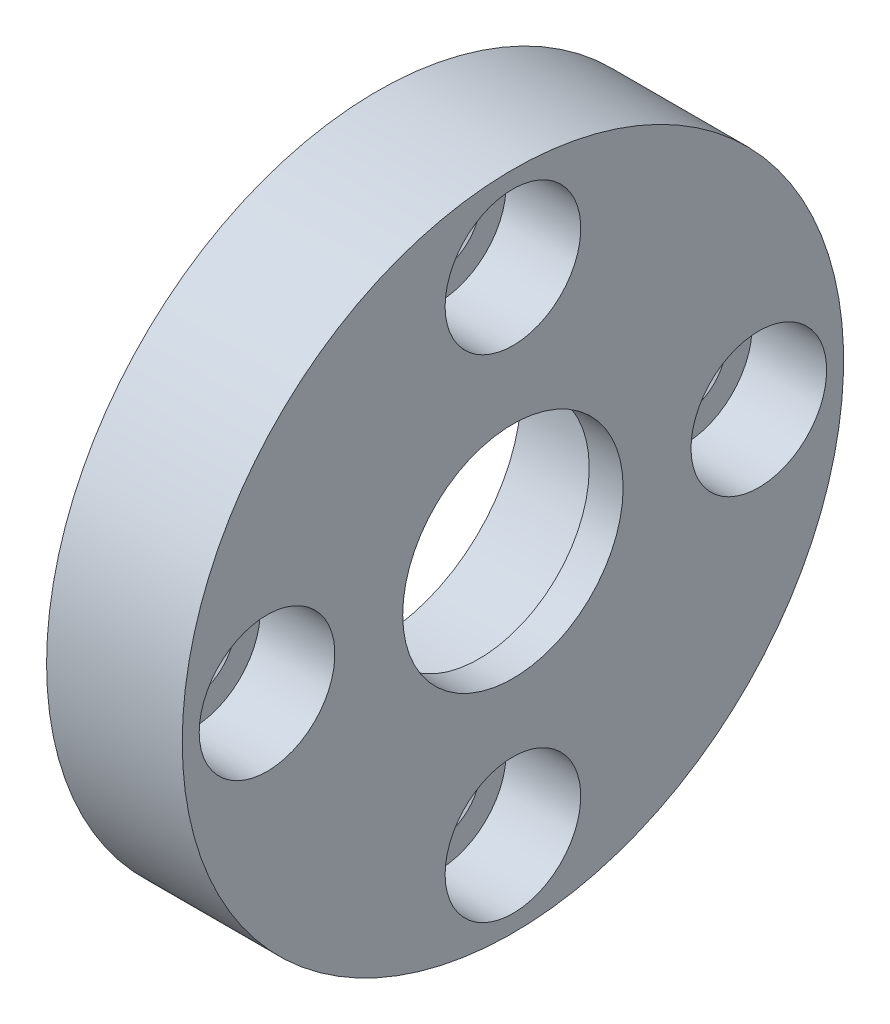
ISO-10303-21;
HEADER;
FILE_DESCRIPTION(('STEP AP214'),'2;1');
FILE_NAME('part.step','',(''),(''),'','','');
FILE_SCHEMA(('AUTOMOTIVE_DESIGN { 1 0 10303 214 1 1 1 1 }'));
ENDSEC;
DATA;
#1=APPLICATION_CONTEXT('core data for automotive mechanical design processes');
#2=APPLICATION_PROTOCOL_DEFINITION('international standard','automotive_design',2000,#1);
#3=PRODUCT_CONTEXT('',#1,'mechanical');
#4=PRODUCT('Part','Part','',(#3));
#5=PRODUCT_RELATED_PRODUCT_CATEGORY('part','',(#4));
#6=PRODUCT_DEFINITION_FORMATION('','',#4);
#7=PRODUCT_DEFINITION_CONTEXT('part definition',#1,'design');
#8=PRODUCT_DEFINITION('design','',#6,#7);
#9=PRODUCT_DEFINITION_SHAPE('','',#8);
#10=(LENGTH_UNIT() NAMED_UNIT(*) SI_UNIT(.MILLI.,.METRE.));
#11=(NAMED_UNIT(*) PLANE_ANGLE_UNIT() SI_UNIT($,.RADIAN.));
#12=(NAMED_UNIT(*) SI_UNIT($,.STERADIAN.) SOLID_ANGLE_UNIT());
#13=UNCERTAINTY_MEASURE_WITH_UNIT(LENGTH_MEASURE(1.E-05),#10,'distance_accuracy_value','');
#14=(GEOMETRIC_REPRESENTATION_CONTEXT(3) GLOBAL_UNCERTAINTY_ASSIGNED_CONTEXT((#13)) GLOBAL_UNIT_ASSIGNED_CONTEXT((#10,
#11,#12)) REPRESENTATION_CONTEXT('',''));
#15=CARTESIAN_POINT('',(0.,0.,0.));
#16=DIRECTION('',(0.,0.,1.));
#17=DIRECTION('',(1.,0.,0.));
#18=AXIS2_PLACEMENT_3D('',#15,#16,#17);
#19=CARTESIAN_POINT('',(-4.,0.,0.));
#20=DIRECTION('',(1.,0.,0.));
#21=DIRECTION('',(0.,0.,-1.));
#22=AXIS2_PLACEMENT_3D('',#19,#20,#21);
#23=PLANE('',#22);
#24=CARTESIAN_POINT('',(-4.,0.,-14.5));
#25=DIRECTION('',(-1.,0.,0.));
#26=DIRECTION('',(0.,0.,1.));
#27=AXIS2_PLACEMENT_3D('',#24,#25,#26);
#28=CIRCLE('',#27,2.5);
#29=CARTESIAN_POINT('',(-4.,0.,-12.));
#30=VERTEX_POINT('',#29);
#31=EDGE_CURVE('E110',#30,#30,#28,.T.);
#32=ORIENTED_EDGE('',*,*,#31,.F.);
#33=EDGE_LOOP('',(#32));
#34=FACE_BOUND('',#33,.T.);
#35=CARTESIAN_POINT('',(-4.,-14.5,0.));
#36=DIRECTION('',(-1.,0.,0.));
#37=DIRECTION('',(0.,0.,1.));
#38=AXIS2_PLACEMENT_3D('',#35,#36,#37);
#39=CIRCLE('',#38,2.5);
#40=CARTESIAN_POINT('',(-4.,-14.5,2.5));
#41=VERTEX_POINT('',#40);
#42=EDGE_CURVE('E92',#41,#41,#39,.T.);
#43=ORIENTED_EDGE('',*,*,#42,.F.);
#44=EDGE_LOOP('',(#43));
#45=FACE_BOUND('',#44,.T.);
#46=CARTESIAN_POINT('',(-4.,0.,14.5));
#47=DIRECTION('',(-1.,0.,0.));
#48=DIRECTION('',(0.,0.,1.));
#49=AXIS2_PLACEMENT_3D('',#46,#47,#48);
#50=CIRCLE('',#49,2.5);
#51=CARTESIAN_POINT('',(-4.,0.,17.));
#52=VERTEX_POINT('',#51);
#53=EDGE_CURVE('E74',#52,#52,#50,.T.);
#54=ORIENTED_EDGE('',*,*,#53,.F.);
#55=EDGE_LOOP('',(#54));
#56=FACE_BOUND('',#55,.T.);
#57=CARTESIAN_POINT('',(-4.,14.5,0.));
#58=DIRECTION('',(-1.,0.,0.));
#59=DIRECTION('',(0.,0.,1.));
#60=AXIS2_PLACEMENT_3D('',#57,#58,#59);
#61=CIRCLE('',#60,2.5);
#62=CARTESIAN_POINT('',(-4.,14.5,2.5));
#63=VERTEX_POINT('',#62);
#64=EDGE_CURVE('E56',#63,#63,#61,.T.);
#65=ORIENTED_EDGE('',*,*,#64,.F.);
#66=EDGE_LOOP('',(#65));
#67=FACE_BOUND('',#66,.T.);
#68=CARTESIAN_POINT('',(-4.,0.,0.));
#69=DIRECTION('',(-1.,0.,0.));
#70=DIRECTION('',(0.,0.,1.));
#71=AXIS2_PLACEMENT_3D('',#68,#69,#70);
#72=CIRCLE('',#71,8.5);
#73=CARTESIAN_POINT('',(-4.,0.,8.5));
#74=VERTEX_POINT('',#73);
#75=EDGE_CURVE('E41',#74,#74,#72,.T.);
#76=ORIENTED_EDGE('',*,*,#75,.F.);
#77=EDGE_LOOP('',(#76));
#78=FACE_BOUND('',#77,.T.);
#79=CARTESIAN_POINT('',(-4.,0.,0.));
#80=DIRECTION('',(-1.,0.,0.));
#81=DIRECTION('',(0.,0.,1.));
#82=AXIS2_PLACEMENT_3D('',#79,#80,#81);
#83=CIRCLE('',#82,19.5);
#84=CARTESIAN_POINT('',(-4.,0.,19.5));
#85=VERTEX_POINT('',#84);
#86=EDGE_CURVE('E10',#85,#85,#83,.T.);
#87=ORIENTED_EDGE('',*,*,#86,.T.);
#88=EDGE_LOOP('',(#87));
#89=FACE_BOUND('',#88,.T.);
#90=ADVANCED_FACE('F31',(#34,#45,#56,#67,#78,#89),#23,.F.);
#91=CARTESIAN_POINT('',(4.,0.,0.));
#92=DIRECTION('',(-1.,0.,0.));
#93=DIRECTION('',(0.,0.,1.));
#94=AXIS2_PLACEMENT_3D('',#91,#92,#93);
#95=CYLINDRICAL_SURFACE('',#94,19.5);
#96=ORIENTED_EDGE('',*,*,#86,.F.);
#97=EDGE_LOOP('',(#96));
#98=FACE_BOUND('',#97,.T.);
#99=CARTESIAN_POINT('',(4.,0.,0.));
#100=DIRECTION('',(-1.,0.,0.));
#101=DIRECTION('',(0.,0.,1.));
#102=AXIS2_PLACEMENT_3D('',#99,#100,#101);
#103=CIRCLE('',#102,19.5);
#104=CARTESIAN_POINT('',(4.,0.,19.5));
#105=VERTEX_POINT('',#104);
#106=EDGE_CURVE('E37',#105,#105,#103,.T.);
#107=ORIENTED_EDGE('',*,*,#106,.T.);
#108=EDGE_LOOP('',(#107));
#109=FACE_BOUND('',#108,.T.);
#110=ADVANCED_FACE('F144',(#98,#109),#95,.T.);
#111=CARTESIAN_POINT('',(4.,19.5,0.));
#112=DIRECTION('',(-1.,0.,0.));
#113=DIRECTION('',(0.,0.,1.));
#114=AXIS2_PLACEMENT_3D('',#111,#112,#113);
#115=PLANE('',#114);
#116=CARTESIAN_POINT('',(4.,0.,-14.5));
#117=DIRECTION('',(-1.,0.,0.));
#118=DIRECTION('',(0.,0.,1.));
#119=AXIS2_PLACEMENT_3D('',#116,#117,#118);
#120=CIRCLE('',#119,4.);
#121=CARTESIAN_POINT('',(4.,0.,-10.5));
#122=VERTEX_POINT('',#121);
#123=EDGE_CURVE('E125',#122,#122,#120,.T.);
#124=ORIENTED_EDGE('',*,*,#123,.T.);
#125=EDGE_LOOP('',(#124));
#126=FACE_BOUND('',#125,.T.);
#127=CARTESIAN_POINT('',(4.,-14.5,0.));
#128=DIRECTION('',(-1.,0.,0.));
#129=DIRECTION('',(0.,0.,1.));
#130=AXIS2_PLACEMENT_3D('',#127,#128,#129);
#131=CIRCLE('',#130,4.);
#132=CARTESIAN_POINT('',(4.,-14.5,4.));
#133=VERTEX_POINT('',#132);
#134=EDGE_CURVE('E107',#133,#133,#131,.T.);
#135=ORIENTED_EDGE('',*,*,#134,.T.);
#136=EDGE_LOOP('',(#135));
#137=FACE_BOUND('',#136,.T.);
#138=CARTESIAN_POINT('',(4.,0.,14.5));
#139=DIRECTION('',(-1.,0.,0.));
#140=DIRECTION('',(0.,0.,1.));
#141=AXIS2_PLACEMENT_3D('',#138,#139,#140);
#142=CIRCLE('',#141,4.);
#143=CARTESIAN_POINT('',(4.,0.,18.5));
#144=VERTEX_POINT('',#143);
#145=EDGE_CURVE('E89',#144,#144,#142,.T.);
#146=ORIENTED_EDGE('',*,*,#145,.T.);
#147=EDGE_LOOP('',(#146));
#148=FACE_BOUND('',#147,.T.);
#149=CARTESIAN_POINT('',(4.,14.5,0.));
#150=DIRECTION('',(-1.,0.,0.));
#151=DIRECTION('',(0.,0.,1.));
#152=AXIS2_PLACEMENT_3D('',#149,#150,#151);
#153=CIRCLE('',#152,4.);
#154=CARTESIAN_POINT('',(4.,14.5,4.));
#155=VERTEX_POINT('',#154);
#156=EDGE_CURVE('E71',#155,#155,#153,.T.);
#157=ORIENTED_EDGE('',*,*,#156,.T.);
#158=EDGE_LOOP('',(#157));
#159=FACE_BOUND('',#158,.T.);
#160=CARTESIAN_POINT('',(4.,0.,0.));
#161=DIRECTION('',(-1.,0.,0.));
#162=DIRECTION('',(0.,0.,1.));
#163=AXIS2_PLACEMENT_3D('',#160,#161,#162);
#164=CIRCLE('',#163,6.5);
#165=CARTESIAN_POINT('',(4.,0.,6.5));
#166=VERTEX_POINT('',#165);
#167=EDGE_CURVE('E53',#166,#166,#164,.T.);
#168=ORIENTED_EDGE('',*,*,#167,.T.);
#169=EDGE_LOOP('',(#168));
#170=FACE_BOUND('',#169,.T.);
#171=ORIENTED_EDGE('',*,*,#106,.F.);
#172=EDGE_LOOP('',(#171));
#173=FACE_BOUND('',#172,.T.);
#174=ADVANCED_FACE('F129',(#126,#137,#148,#159,#170,#173),#115,.F.);
#175=CARTESIAN_POINT('',(4.,0.,0.));
#176=DIRECTION('',(-1.,0.,0.));
#177=DIRECTION('',(0.,0.,1.));
#178=AXIS2_PLACEMENT_3D('',#175,#176,#177);
#179=CYLINDRICAL_SURFACE('',#178,8.5);
#180=ORIENTED_EDGE('',*,*,#75,.T.);
#181=EDGE_LOOP('',(#180));
#182=FACE_BOUND('',#181,.T.);
#183=CARTESIAN_POINT('',(2.,0.,0.));
#184=DIRECTION('',(-1.,0.,0.));
#185=DIRECTION('',(0.,0.,1.));
#186=AXIS2_PLACEMENT_3D('',#183,#184,#185);
#187=CIRCLE('',#186,8.5);
#188=CARTESIAN_POINT('',(2.,0.,8.5));
#189=VERTEX_POINT('',#188);
#190=EDGE_CURVE('E45',#189,#189,#187,.T.);
#191=ORIENTED_EDGE('',*,*,#190,.F.);
#192=EDGE_LOOP('',(#191));
#193=FACE_BOUND('',#192,.T.);
#194=ADVANCED_FACE('F160',(#182,#193),#179,.F.);
#195=CARTESIAN_POINT('',(2.,8.5,0.));
#196=DIRECTION('',(-1.,0.,0.));
#197=DIRECTION('',(0.,0.,1.));
#198=AXIS2_PLACEMENT_3D('',#195,#196,#197);
#199=PLANE('',#198);
#200=ORIENTED_EDGE('',*,*,#190,.T.);
#201=EDGE_LOOP('',(#200));
#202=FACE_BOUND('',#201,.T.);
#203=CARTESIAN_POINT('',(2.,0.,0.));
#204=DIRECTION('',(-1.,0.,0.));
#205=DIRECTION('',(0.,0.,1.));
#206=AXIS2_PLACEMENT_3D('',#203,#204,#205);
#207=CIRCLE('',#206,6.5);
#208=CARTESIAN_POINT('',(2.,0.,6.5));
#209=VERTEX_POINT('',#208);
#210=EDGE_CURVE('E50',#209,#209,#207,.T.);
#211=ORIENTED_EDGE('',*,*,#210,.F.);
#212=EDGE_LOOP('',(#211));
#213=FACE_BOUND('',#212,.T.);
#214=ADVANCED_FACE('F163',(#202,#213),#199,.T.);
#215=CARTESIAN_POINT('',(4.,0.,0.));
#216=DIRECTION('',(-1.,0.,0.));
#217=DIRECTION('',(0.,0.,1.));
#218=AXIS2_PLACEMENT_3D('',#215,#216,#217);
#219=CYLINDRICAL_SURFACE('',#218,6.5);
#220=ORIENTED_EDGE('',*,*,#210,.T.);
#221=EDGE_LOOP('',(#220));
#222=FACE_BOUND('',#221,.T.);
#223=ORIENTED_EDGE('',*,*,#167,.F.);
#224=EDGE_LOOP('',(#223));
#225=FACE_BOUND('',#224,.T.);
#226=ADVANCED_FACE('F169',(#222,#225),#219,.F.);
#227=CARTESIAN_POINT('',(-3.567,14.5,0.));
#228=DIRECTION('',(-1.,0.,0.));
#229=DIRECTION('',(0.,0.,1.));
#230=AXIS2_PLACEMENT_3D('',#227,#228,#229);
#231=CONICAL_SURFACE('',#230,2.067,0.785398163397451);
#232=ORIENTED_EDGE('',*,*,#64,.T.);
#233=EDGE_LOOP('',(#232));
#234=FACE_BOUND('',#233,.T.);
#235=CARTESIAN_POINT('',(-3.567,14.5,0.));
#236=DIRECTION('',(-1.,0.,0.));
#237=DIRECTION('',(0.,0.,1.));
#238=AXIS2_PLACEMENT_3D('',#235,#236,#237);
#239=CIRCLE('',#238,2.067);
#240=CARTESIAN_POINT('',(-3.567,14.5,2.067));
#241=VERTEX_POINT('',#240);
#242=EDGE_CURVE('E59',#241,#241,#239,.T.);
#243=ORIENTED_EDGE('',*,*,#242,.F.);
#244=EDGE_LOOP('',(#243));
#245=FACE_BOUND('',#244,.T.);
#246=ADVANCED_FACE('F175',(#234,#245),#231,.F.);
#247=CARTESIAN_POINT('',(4.,14.5,0.));
#248=DIRECTION('',(-1.,0.,0.));
#249=DIRECTION('',(0.,0.,1.));
#250=AXIS2_PLACEMENT_3D('',#247,#248,#249);
#251=CYLINDRICAL_SURFACE('',#250,2.067);
#252=ORIENTED_EDGE('',*,*,#242,.T.);
#253=EDGE_LOOP('',(#252));
#254=FACE_BOUND('',#253,.T.);
#255=CARTESIAN_POINT('',(-0.83299999999999,14.5,0.));
#256=DIRECTION('',(-1.,0.,0.));
#257=DIRECTION('',(0.,0.,1.));
#258=AXIS2_PLACEMENT_3D('',#255,#256,#257);
#259=CIRCLE('',#258,2.067);
#260=CARTESIAN_POINT('',(-0.83299999999999,14.5,2.067));
#261=VERTEX_POINT('',#260);
#262=EDGE_CURVE('E62',#261,#261,#259,.T.);
#263=ORIENTED_EDGE('',*,*,#262,.F.);
#264=EDGE_LOOP('',(#263));
#265=FACE_BOUND('',#264,.T.);
#266=ADVANCED_FACE('F187',(#254,#265),#251,.F.);
#267=CARTESIAN_POINT('',(-0.4,14.5,0.));
#268=DIRECTION('',(1.,0.,0.));
#269=DIRECTION('',(0.,0.,-1.));
#270=AXIS2_PLACEMENT_3D('',#267,#268,#269);
#271=CONICAL_SURFACE('',#270,2.5,0.785398163397463);
#272=ORIENTED_EDGE('',*,*,#262,.T.);
#273=EDGE_LOOP('',(#272));
#274=FACE_BOUND('',#273,.T.);
#275=CARTESIAN_POINT('',(-0.4,14.5,0.));
#276=DIRECTION('',(-1.,0.,0.));
#277=DIRECTION('',(0.,0.,1.));
#278=AXIS2_PLACEMENT_3D('',#275,#276,#277);
#279=CIRCLE('',#278,2.5);
#280=CARTESIAN_POINT('',(-0.4,14.5,2.5));
#281=VERTEX_POINT('',#280);
#282=EDGE_CURVE('E65',#281,#281,#279,.T.);
#283=ORIENTED_EDGE('',*,*,#282,.F.);
#284=EDGE_LOOP('',(#283));
#285=FACE_BOUND('',#284,.T.);
#286=ADVANCED_FACE('F191',(#274,#285),#271,.F.);
#287=CARTESIAN_POINT('',(-0.4,17.,0.));
#288=DIRECTION('',(1.,0.,0.));
#289=DIRECTION('',(0.,0.,-1.));
#290=AXIS2_PLACEMENT_3D('',#287,#288,#289);
#291=PLANE('',#290);
#292=ORIENTED_EDGE('',*,*,#282,.T.);
#293=EDGE_LOOP('',(#292));
#294=FACE_BOUND('',#293,.T.);
#295=CARTESIAN_POINT('',(-0.4,14.5,0.));
#296=DIRECTION('',(-1.,0.,0.));
#297=DIRECTION('',(0.,0.,1.));
#298=AXIS2_PLACEMENT_3D('',#295,#296,#297);
#299=CIRCLE('',#298,4.);
#300=CARTESIAN_POINT('',(-0.4,14.5,4.));
#301=VERTEX_POINT('',#300);
#302=EDGE_CURVE('E68',#301,#301,#299,.T.);
#303=ORIENTED_EDGE('',*,*,#302,.F.);
#304=EDGE_LOOP('',(#303));
#305=FACE_BOUND('',#304,.T.);
#306=ADVANCED_FACE('F195',(#294,#305),#291,.T.);
#307=CARTESIAN_POINT('',(4.,14.5,0.));
#308=DIRECTION('',(-1.,0.,0.));
#309=DIRECTION('',(0.,0.,1.));
#310=AXIS2_PLACEMENT_3D('',#307,#308,#309);
#311=CYLINDRICAL_SURFACE('',#310,4.);
#312=ORIENTED_EDGE('',*,*,#302,.T.);
#313=EDGE_LOOP('',(#312));
#314=FACE_BOUND('',#313,.T.);
#315=ORIENTED_EDGE('',*,*,#156,.F.);
#316=EDGE_LOOP('',(#315));
#317=FACE_BOUND('',#316,.T.);
#318=ADVANCED_FACE('F199',(#314,#317),#311,.F.);
#319=CARTESIAN_POINT('',(-3.567,0.,14.5));
#320=DIRECTION('',(-1.,0.,0.));
#321=DIRECTION('',(0.,0.,1.));
#322=AXIS2_PLACEMENT_3D('',#319,#320,#321);
#323=CONICAL_SURFACE('',#322,2.067,0.785398163397451);
#324=ORIENTED_EDGE('',*,*,#53,.T.);
#325=EDGE_LOOP('',(#324));
#326=FACE_BOUND('',#325,.T.);
#327=CARTESIAN_POINT('',(-3.567,0.,14.5));
#328=DIRECTION('',(-1.,0.,0.));
#329=DIRECTION('',(0.,0.,1.));
#330=AXIS2_PLACEMENT_3D('',#327,#328,#329);
#331=CIRCLE('',#330,2.067);
#332=CARTESIAN_POINT('',(-3.567,0.,16.567));
#333=VERTEX_POINT('',#332);
#334=EDGE_CURVE('E77',#333,#333,#331,.T.);
#335=ORIENTED_EDGE('',*,*,#334,.F.);
#336=EDGE_LOOP('',(#335));
#337=FACE_BOUND('',#336,.T.);
#338=ADVANCED_FACE('F203',(#326,#337),#323,.F.);
#339=CARTESIAN_POINT('',(4.,0.,14.5));
#340=DIRECTION('',(-1.,0.,0.));
#341=DIRECTION('',(0.,0.,1.));
#342=AXIS2_PLACEMENT_3D('',#339,#340,#341);
#343=CYLINDRICAL_SURFACE('',#342,2.067);
#344=ORIENTED_EDGE('',*,*,#334,.T.);
#345=EDGE_LOOP('',(#344));
#346=FACE_BOUND('',#345,.T.);
#347=CARTESIAN_POINT('',(-0.83299999999999,0.,14.5));
#348=DIRECTION('',(-1.,0.,0.));
#349=DIRECTION('',(0.,0.,1.));
#350=AXIS2_PLACEMENT_3D('',#347,#348,#349);
#351=CIRCLE('',#350,2.067);
#352=CARTESIAN_POINT('',(-0.83299999999999,0.,16.567));
#353=VERTEX_POINT('',#352);
#354=EDGE_CURVE('E80',#353,#353,#351,.T.);
#355=ORIENTED_EDGE('',*,*,#354,.F.);
#356=EDGE_LOOP('',(#355));
#357=FACE_BOUND('',#356,.T.);
#358=ADVANCED_FACE('F207',(#346,#357),#343,.F.);
#359=CARTESIAN_POINT('',(-0.4,0.,14.5));
#360=DIRECTION('',(1.,0.,0.));
#361=DIRECTION('',(0.,0.,-1.));
#362=AXIS2_PLACEMENT_3D('',#359,#360,#361);
#363=CONICAL_SURFACE('',#362,2.5,0.785398163397463);
#364=ORIENTED_EDGE('',*,*,#354,.T.);
#365=EDGE_LOOP('',(#364));
#366=FACE_BOUND('',#365,.T.);
#367=CARTESIAN_POINT('',(-0.4,0.,14.5));
#368=DIRECTION('',(-1.,0.,0.));
#369=DIRECTION('',(0.,0.,1.));
#370=AXIS2_PLACEMENT_3D('',#367,#368,#369);
#371=CIRCLE('',#370,2.5);
#372=CARTESIAN_POINT('',(-0.4,0.,17.));
#373=VERTEX_POINT('',#372);
#374=EDGE_CURVE('E83',#373,#373,#371,.T.);
#375=ORIENTED_EDGE('',*,*,#374,.F.);
#376=EDGE_LOOP('',(#375));
#377=FACE_BOUND('',#376,.T.);
#378=ADVANCED_FACE('F211',(#366,#377),#363,.F.);
#379=CARTESIAN_POINT('',(-0.4,2.5,14.5));
#380=DIRECTION('',(1.,0.,0.));
#381=DIRECTION('',(0.,0.,-1.));
#382=AXIS2_PLACEMENT_3D('',#379,#380,#381);
#383=PLANE('',#382);
#384=ORIENTED_EDGE('',*,*,#374,.T.);
#385=EDGE_LOOP('',(#384));
#386=FACE_BOUND('',#385,.T.);
#387=CARTESIAN_POINT('',(-0.4,0.,14.5));
#388=DIRECTION('',(-1.,0.,0.));
#389=DIRECTION('',(0.,0.,1.));
#390=AXIS2_PLACEMENT_3D('',#387,#388,#389);
#391=CIRCLE('',#390,4.);
#392=CARTESIAN_POINT('',(-0.4,0.,18.5));
#393=VERTEX_POINT('',#392);
#394=EDGE_CURVE('E86',#393,#393,#391,.T.);
#395=ORIENTED_EDGE('',*,*,#394,.F.);
#396=EDGE_LOOP('',(#395));
#397=FACE_BOUND('',#396,.T.);
#398=ADVANCED_FACE('F215',(#386,#397),#383,.T.);
#399=CARTESIAN_POINT('',(4.,0.,14.5));
#400=DIRECTION('',(-1.,0.,0.));
#401=DIRECTION('',(0.,0.,1.));
#402=AXIS2_PLACEMENT_3D('',#399,#400,#401);
#403=CYLINDRICAL_SURFACE('',#402,4.);
#404=ORIENTED_EDGE('',*,*,#394,.T.);
#405=EDGE_LOOP('',(#404));
#406=FACE_BOUND('',#405,.T.);
#407=ORIENTED_EDGE('',*,*,#145,.F.);
#408=EDGE_LOOP('',(#407));
#409=FACE_BOUND('',#408,.T.);
#410=ADVANCED_FACE('F219',(#406,#409),#403,.F.);
#411=CARTESIAN_POINT('',(-3.567,-14.5,0.));
#412=DIRECTION('',(-1.,0.,0.));
#413=DIRECTION('',(0.,0.,1.));
#414=AXIS2_PLACEMENT_3D('',#411,#412,#413);
#415=CONICAL_SURFACE('',#414,2.067,0.785398163397451);
#416=ORIENTED_EDGE('',*,*,#42,.T.);
#417=EDGE_LOOP('',(#416));
#418=FACE_BOUND('',#417,.T.);
#419=CARTESIAN_POINT('',(-3.567,-14.5,0.));
#420=DIRECTION('',(-1.,0.,0.));
#421=DIRECTION('',(0.,0.,1.));
#422=AXIS2_PLACEMENT_3D('',#419,#420,#421);
#423=CIRCLE('',#422,2.067);
#424=CARTESIAN_POINT('',(-3.567,-14.5,2.067));
#425=VERTEX_POINT('',#424);
#426=EDGE_CURVE('E95',#425,#425,#423,.T.);
#427=ORIENTED_EDGE('',*,*,#426,.F.);
#428=EDGE_LOOP('',(#427));
#429=FACE_BOUND('',#428,.T.);
#430=ADVANCED_FACE('F223',(#418,#429),#415,.F.);
#431=CARTESIAN_POINT('',(4.,-14.5,0.));
#432=DIRECTION('',(-1.,0.,0.));
#433=DIRECTION('',(0.,0.,1.));
#434=AXIS2_PLACEMENT_3D('',#431,#432,#433);
#435=CYLINDRICAL_SURFACE('',#434,2.067);
#436=ORIENTED_EDGE('',*,*,#426,.T.);
#437=EDGE_LOOP('',(#436));
#438=FACE_BOUND('',#437,.T.);
#439=CARTESIAN_POINT('',(-0.83299999999999,-14.5,0.));
#440=DIRECTION('',(-1.,0.,0.));
#441=DIRECTION('',(0.,0.,1.));
#442=AXIS2_PLACEMENT_3D('',#439,#440,#441);
#443=CIRCLE('',#442,2.067);
#444=CARTESIAN_POINT('',(-0.83299999999999,-14.5,2.067));
#445=VERTEX_POINT('',#444);
#446=EDGE_CURVE('E98',#445,#445,#443,.T.);
#447=ORIENTED_EDGE('',*,*,#446,.F.);
#448=EDGE_LOOP('',(#447));
#449=FACE_BOUND('',#448,.T.);
#450=ADVANCED_FACE('F227',(#438,#449),#435,.F.);
#451=CARTESIAN_POINT('',(-0.4,-14.5,0.));
#452=DIRECTION('',(1.,0.,0.));
#453=DIRECTION('',(0.,0.,-1.));
#454=AXIS2_PLACEMENT_3D('',#451,#452,#453);
#455=CONICAL_SURFACE('',#454,2.5,0.785398163397463);
#456=ORIENTED_EDGE('',*,*,#446,.T.);
#457=EDGE_LOOP('',(#456));
#458=FACE_BOUND('',#457,.T.);
#459=CARTESIAN_POINT('',(-0.4,-14.5,0.));
#460=DIRECTION('',(-1.,0.,0.));
#461=DIRECTION('',(0.,0.,1.));
#462=AXIS2_PLACEMENT_3D('',#459,#460,#461);
#463=CIRCLE('',#462,2.5);
#464=CARTESIAN_POINT('',(-0.4,-14.5,2.5));
#465=VERTEX_POINT('',#464);
#466=EDGE_CURVE('E101',#465,#465,#463,.T.);
#467=ORIENTED_EDGE('',*,*,#466,.F.);
#468=EDGE_LOOP('',(#467));
#469=FACE_BOUND('',#468,.T.);
#470=ADVANCED_FACE('F231',(#458,#469),#455,.F.);
#471=CARTESIAN_POINT('',(-0.4,-12.,0.));
#472=DIRECTION('',(1.,0.,0.));
#473=DIRECTION('',(0.,0.,-1.));
#474=AXIS2_PLACEMENT_3D('',#471,#472,#473);
#475=PLANE('',#474);
#476=ORIENTED_EDGE('',*,*,#466,.T.);
#477=EDGE_LOOP('',(#476));
#478=FACE_BOUND('',#477,.T.);
#479=CARTESIAN_POINT('',(-0.4,-14.5,0.));
#480=DIRECTION('',(-1.,0.,0.));
#481=DIRECTION('',(0.,0.,1.));
#482=AXIS2_PLACEMENT_3D('',#479,#480,#481);
#483=CIRCLE('',#482,4.);
#484=CARTESIAN_POINT('',(-0.4,-14.5,4.));
#485=VERTEX_POINT('',#484);
#486=EDGE_CURVE('E104',#485,#485,#483,.T.);
#487=ORIENTED_EDGE('',*,*,#486,.F.);
#488=EDGE_LOOP('',(#487));
#489=FACE_BOUND('',#488,.T.);
#490=ADVANCED_FACE('F235',(#478,#489),#475,.T.);
#491=CARTESIAN_POINT('',(4.,-14.5,0.));
#492=DIRECTION('',(-1.,0.,0.));
#493=DIRECTION('',(0.,0.,1.));
#494=AXIS2_PLACEMENT_3D('',#491,#492,#493);
#495=CYLINDRICAL_SURFACE('',#494,4.);
#496=ORIENTED_EDGE('',*,*,#486,.T.);
#497=EDGE_LOOP('',(#496));
#498=FACE_BOUND('',#497,.T.);
#499=ORIENTED_EDGE('',*,*,#134,.F.);
#500=EDGE_LOOP('',(#499));
#501=FACE_BOUND('',#500,.T.);
#502=ADVANCED_FACE('F239',(#498,#501),#495,.F.);
#503=CARTESIAN_POINT('',(-3.567,0.,-14.5));
#504=DIRECTION('',(-1.,0.,0.));
#505=DIRECTION('',(0.,0.,1.));
#506=AXIS2_PLACEMENT_3D('',#503,#504,#505);
#507=CONICAL_SURFACE('',#506,2.067,0.785398163397451);
#508=ORIENTED_EDGE('',*,*,#31,.T.);
#509=EDGE_LOOP('',(#508));
#510=FACE_BOUND('',#509,.T.);
#511=CARTESIAN_POINT('',(-3.567,0.,-14.5));
#512=DIRECTION('',(-1.,0.,0.));
#513=DIRECTION('',(0.,0.,1.));
#514=AXIS2_PLACEMENT_3D('',#511,#512,#513);
#515=CIRCLE('',#514,2.067);
#516=CARTESIAN_POINT('',(-3.567,0.,-12.433));
#517=VERTEX_POINT('',#516);
#518=EDGE_CURVE('E113',#517,#517,#515,.T.);
#519=ORIENTED_EDGE('',*,*,#518,.F.);
#520=EDGE_LOOP('',(#519));
#521=FACE_BOUND('',#520,.T.);
#522=ADVANCED_FACE('F243',(#510,#521),#507,.F.);
#523=CARTESIAN_POINT('',(4.,0.,-14.5));
#524=DIRECTION('',(-1.,0.,0.));
#525=DIRECTION('',(0.,0.,1.));
#526=AXIS2_PLACEMENT_3D('',#523,#524,#525);
#527=CYLINDRICAL_SURFACE('',#526,2.067);
#528=ORIENTED_EDGE('',*,*,#518,.T.);
#529=EDGE_LOOP('',(#528));
#530=FACE_BOUND('',#529,.T.);
#531=CARTESIAN_POINT('',(-0.83299999999999,0.,-14.5));
#532=DIRECTION('',(-1.,0.,0.));
#533=DIRECTION('',(0.,0.,1.));
#534=AXIS2_PLACEMENT_3D('',#531,#532,#533);
#535=CIRCLE('',#534,2.067);
#536=CARTESIAN_POINT('',(-0.83299999999999,0.,-12.433));
#537=VERTEX_POINT('',#536);
#538=EDGE_CURVE('E116',#537,#537,#535,.T.);
#539=ORIENTED_EDGE('',*,*,#538,.F.);
#540=EDGE_LOOP('',(#539));
#541=FACE_BOUND('',#540,.T.);
#542=ADVANCED_FACE('F247',(#530,#541),#527,.F.);
#543=CARTESIAN_POINT('',(-0.4,0.,-14.5));
#544=DIRECTION('',(1.,0.,0.));
#545=DIRECTION('',(0.,0.,-1.));
#546=AXIS2_PLACEMENT_3D('',#543,#544,#545);
#547=CONICAL_SURFACE('',#546,2.5,0.785398163397463);
#548=ORIENTED_EDGE('',*,*,#538,.T.);
#549=EDGE_LOOP('',(#548));
#550=FACE_BOUND('',#549,.T.);
#551=CARTESIAN_POINT('',(-0.4,0.,-14.5));
#552=DIRECTION('',(-1.,0.,0.));
#553=DIRECTION('',(0.,0.,1.));
#554=AXIS2_PLACEMENT_3D('',#551,#552,#553);
#555=CIRCLE('',#554,2.5);
#556=CARTESIAN_POINT('',(-0.4,0.,-12.));
#557=VERTEX_POINT('',#556);
#558=EDGE_CURVE('E119',#557,#557,#555,.T.);
#559=ORIENTED_EDGE('',*,*,#558,.F.);
#560=EDGE_LOOP('',(#559));
#561=FACE_BOUND('',#560,.T.);
#562=ADVANCED_FACE('F140',(#550,#561),#547,.F.);
#563=CARTESIAN_POINT('',(-0.4,2.5,-14.5));
#564=DIRECTION('',(1.,0.,0.));
#565=DIRECTION('',(0.,0.,-1.));
#566=AXIS2_PLACEMENT_3D('',#563,#564,#565);
#567=PLANE('',#566);
#568=ORIENTED_EDGE('',*,*,#558,.T.);
#569=EDGE_LOOP('',(#568));
#570=FACE_BOUND('',#569,.T.);
#571=CARTESIAN_POINT('',(-0.4,0.,-14.5));
#572=DIRECTION('',(-1.,0.,0.));
#573=DIRECTION('',(0.,0.,1.));
#574=AXIS2_PLACEMENT_3D('',#571,#572,#573);
#575=CIRCLE('',#574,4.);
#576=CARTESIAN_POINT('',(-0.4,0.,-10.5));
#577=VERTEX_POINT('',#576);
#578=EDGE_CURVE('E122',#577,#577,#575,.T.);
#579=ORIENTED_EDGE('',*,*,#578,.F.);
#580=EDGE_LOOP('',(#579));
#581=FACE_BOUND('',#580,.T.);
#582=ADVANCED_FACE('F134',(#570,#581),#567,.T.);
#583=CARTESIAN_POINT('',(4.,0.,-14.5));
#584=DIRECTION('',(-1.,0.,0.));
#585=DIRECTION('',(0.,0.,1.));
#586=AXIS2_PLACEMENT_3D('',#583,#584,#585);
#587=CYLINDRICAL_SURFACE('',#586,4.);
#588=ORIENTED_EDGE('',*,*,#578,.T.);
#589=EDGE_LOOP('',(#588));
#590=FACE_BOUND('',#589,.T.);
#591=ORIENTED_EDGE('',*,*,#123,.F.);
#592=EDGE_LOOP('',(#591));
#593=FACE_BOUND('',#592,.T.);
#594=ADVANCED_FACE('F132',(#590,#593),#587,.F.);
#595=CLOSED_SHELL('',(#90,#110,#174,#194,#214,#226,#246,#266,#286,#306,#318,#338,#358,#378,#398,
#410,#430,#450,#470,#490,#502,#522,#542,#562,#582,#594));
#596=MANIFOLD_SOLID_BREP('B2',#595);
#597=ADVANCED_BREP_SHAPE_REPRESENTATION('',(#18,#596),#14);
#598=SHAPE_DEFINITION_REPRESENTATION(#9,#597);
ENDSEC;
END-ISO-10303-21;
